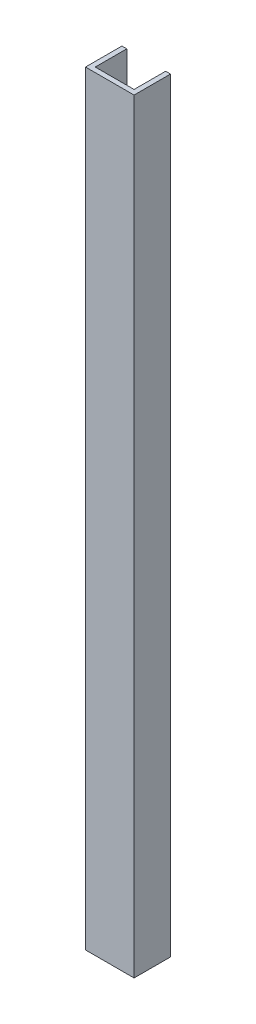
ISO-10303-21;
HEADER;
FILE_DESCRIPTION(('STEP AP214'),'2;1');
FILE_NAME('part.step','',(''),(''),'','','');
FILE_SCHEMA(('AUTOMOTIVE_DESIGN { 1 0 10303 214 1 1 1 1 }'));
ENDSEC;
DATA;
#1=APPLICATION_CONTEXT('core data for automotive mechanical design processes');
#2=APPLICATION_PROTOCOL_DEFINITION('international standard','automotive_design',2000,#1);
#3=PRODUCT_CONTEXT('',#1,'mechanical');
#4=PRODUCT('Part','Part','',(#3));
#5=PRODUCT_RELATED_PRODUCT_CATEGORY('part','',(#4));
#6=PRODUCT_DEFINITION_FORMATION('','',#4);
#7=PRODUCT_DEFINITION_CONTEXT('part definition',#1,'design');
#8=PRODUCT_DEFINITION('design','',#6,#7);
#9=PRODUCT_DEFINITION_SHAPE('','',#8);
#10=(LENGTH_UNIT() NAMED_UNIT(*) SI_UNIT(.MILLI.,.METRE.));
#11=(NAMED_UNIT(*) PLANE_ANGLE_UNIT() SI_UNIT($,.RADIAN.));
#12=(NAMED_UNIT(*) SI_UNIT($,.STERADIAN.) SOLID_ANGLE_UNIT());
#13=UNCERTAINTY_MEASURE_WITH_UNIT(LENGTH_MEASURE(1.E-05),#10,'distance_accuracy_value','');
#14=(GEOMETRIC_REPRESENTATION_CONTEXT(3) GLOBAL_UNCERTAINTY_ASSIGNED_CONTEXT((#13)) GLOBAL_UNIT_ASSIGNED_CONTEXT((#10,
#11,#12)) REPRESENTATION_CONTEXT('',''));
#15=CARTESIAN_POINT('',(0.,0.,0.));
#16=DIRECTION('',(0.,0.,1.));
#17=DIRECTION('',(1.,0.,0.));
#18=AXIS2_PLACEMENT_3D('',#15,#16,#17);
#19=CARTESIAN_POINT('',(8.00000000000001,315.,0.));
#20=DIRECTION('',(1.,0.,0.));
#21=DIRECTION('',(0.,0.,-1.));
#22=AXIS2_PLACEMENT_3D('',#19,#20,#21);
#23=PLANE('',#22);
#24=DIRECTION('',(0.,0.,1.));
#25=VECTOR('',#24,1.);
#26=CARTESIAN_POINT('',(8.00000000000001,0.,0.));
#27=LINE('',#26,#25);
#28=CARTESIAN_POINT('',(8.00000000000001,0.,-13.));
#29=VERTEX_POINT('',#28);
#30=CARTESIAN_POINT('',(8.00000000000001,0.,0.));
#31=VERTEX_POINT('',#30);
#32=EDGE_CURVE('E132',#29,#31,#27,.T.);
#33=ORIENTED_EDGE('',*,*,#32,.T.);
#34=DIRECTION('',(0.,-1.,0.));
#35=VECTOR('',#34,1.);
#36=CARTESIAN_POINT('',(8.00000000000001,315.,0.));
#37=LINE('',#36,#35);
#38=CARTESIAN_POINT('',(8.00000000000001,315.,0.));
#39=VERTEX_POINT('',#38);
#40=EDGE_CURVE('E11',#39,#31,#37,.T.);
#41=ORIENTED_EDGE('',*,*,#40,.F.);
#42=DIRECTION('',(0.,0.,1.));
#43=VECTOR('',#42,1.);
#44=CARTESIAN_POINT('',(8.00000000000001,315.,0.));
#45=LINE('',#44,#43);
#46=CARTESIAN_POINT('',(8.00000000000001,315.,-13.));
#47=VERTEX_POINT('',#46);
#48=EDGE_CURVE('E146',#47,#39,#45,.T.);
#49=ORIENTED_EDGE('',*,*,#48,.F.);
#50=DIRECTION('',(0.,-1.,0.));
#51=VECTOR('',#50,1.);
#52=CARTESIAN_POINT('',(8.00000000000001,315.,-13.));
#53=LINE('',#52,#51);
#54=EDGE_CURVE('E128',#47,#29,#53,.T.);
#55=ORIENTED_EDGE('',*,*,#54,.T.);
#56=EDGE_LOOP('',(#33,#41,#49,#55));
#57=FACE_BOUND('',#56,.T.);
#58=ADVANCED_FACE('F36',(#57),#23,.F.);
#59=CARTESIAN_POINT('',(-7.99999999999999,315.,0.));
#60=DIRECTION('',(0.,0.,1.));
#61=DIRECTION('',(1.,0.,0.));
#62=AXIS2_PLACEMENT_3D('',#59,#60,#61);
#63=PLANE('',#62);
#64=DIRECTION('',(-1.,0.,0.));
#65=VECTOR('',#64,1.);
#66=CARTESIAN_POINT('',(-7.99999999999999,0.,0.));
#67=LINE('',#66,#65);
#68=CARTESIAN_POINT('',(-7.99999999999999,0.,0.));
#69=VERTEX_POINT('',#68);
#70=EDGE_CURVE('E135',#31,#69,#67,.T.);
#71=ORIENTED_EDGE('',*,*,#70,.T.);
#72=DIRECTION('',(0.,-1.,0.));
#73=VECTOR('',#72,1.);
#74=CARTESIAN_POINT('',(-7.99999999999999,315.,0.));
#75=LINE('',#74,#73);
#76=CARTESIAN_POINT('',(-7.99999999999999,315.,0.));
#77=VERTEX_POINT('',#76);
#78=EDGE_CURVE('E44',#77,#69,#75,.T.);
#79=ORIENTED_EDGE('',*,*,#78,.F.);
#80=DIRECTION('',(-1.,0.,0.));
#81=VECTOR('',#80,1.);
#82=CARTESIAN_POINT('',(-7.99999999999999,315.,0.));
#83=LINE('',#82,#81);
#84=EDGE_CURVE('E95',#39,#77,#83,.T.);
#85=ORIENTED_EDGE('',*,*,#84,.F.);
#86=ORIENTED_EDGE('',*,*,#40,.T.);
#87=EDGE_LOOP('',(#71,#79,#85,#86));
#88=FACE_BOUND('',#87,.T.);
#89=ADVANCED_FACE('F181',(#88),#63,.F.);
#90=CARTESIAN_POINT('',(-7.99999999999999,315.,0.));
#91=DIRECTION('',(-1.,0.,0.));
#92=DIRECTION('',(0.,0.,1.));
#93=AXIS2_PLACEMENT_3D('',#90,#91,#92);
#94=PLANE('',#93);
#95=DIRECTION('',(0.,0.,-1.));
#96=VECTOR('',#95,1.);
#97=CARTESIAN_POINT('',(-7.99999999999999,0.,0.));
#98=LINE('',#97,#96);
#99=CARTESIAN_POINT('',(-8.,0.,-13.));
#100=VERTEX_POINT('',#99);
#101=EDGE_CURVE('E137',#69,#100,#98,.T.);
#102=ORIENTED_EDGE('',*,*,#101,.T.);
#103=DIRECTION('',(0.,-1.,0.));
#104=VECTOR('',#103,1.);
#105=CARTESIAN_POINT('',(-8.,315.,-13.));
#106=LINE('',#105,#104);
#107=CARTESIAN_POINT('',(-8.,315.,-13.));
#108=VERTEX_POINT('',#107);
#109=EDGE_CURVE('E153',#108,#100,#106,.T.);
#110=ORIENTED_EDGE('',*,*,#109,.F.);
#111=DIRECTION('',(0.,0.,-1.));
#112=VECTOR('',#111,1.);
#113=CARTESIAN_POINT('',(-7.99999999999999,315.,0.));
#114=LINE('',#113,#112);
#115=EDGE_CURVE('E161',#77,#108,#114,.T.);
#116=ORIENTED_EDGE('',*,*,#115,.F.);
#117=ORIENTED_EDGE('',*,*,#78,.T.);
#118=EDGE_LOOP('',(#102,#110,#116,#117));
#119=FACE_BOUND('',#118,.T.);
#120=ADVANCED_FACE('F159',(#119),#94,.F.);
#121=CARTESIAN_POINT('',(-8.,315.,-13.));
#122=DIRECTION('',(0.,0.,1.));
#123=DIRECTION('',(1.,0.,0.));
#124=AXIS2_PLACEMENT_3D('',#121,#122,#123);
#125=PLANE('',#124);
#126=DIRECTION('',(-1.,0.,0.));
#127=VECTOR('',#126,1.);
#128=CARTESIAN_POINT('',(-8.,0.,-13.));
#129=LINE('',#128,#127);
#130=CARTESIAN_POINT('',(-10.,0.,-13.));
#131=VERTEX_POINT('',#130);
#132=EDGE_CURVE('E139',#100,#131,#129,.T.);
#133=ORIENTED_EDGE('',*,*,#132,.T.);
#134=DIRECTION('',(0.,-1.,0.));
#135=VECTOR('',#134,1.);
#136=CARTESIAN_POINT('',(-10.,315.,-13.));
#137=LINE('',#136,#135);
#138=CARTESIAN_POINT('',(-10.,315.,-13.));
#139=VERTEX_POINT('',#138);
#140=EDGE_CURVE('E150',#139,#131,#137,.T.);
#141=ORIENTED_EDGE('',*,*,#140,.F.);
#142=DIRECTION('',(-1.,0.,0.));
#143=VECTOR('',#142,1.);
#144=CARTESIAN_POINT('',(-8.,315.,-13.));
#145=LINE('',#144,#143);
#146=EDGE_CURVE('E173',#108,#139,#145,.T.);
#147=ORIENTED_EDGE('',*,*,#146,.F.);
#148=ORIENTED_EDGE('',*,*,#109,.T.);
#149=EDGE_LOOP('',(#133,#141,#147,#148));
#150=FACE_BOUND('',#149,.T.);
#151=ADVANCED_FACE('F169',(#150),#125,.F.);
#152=CARTESIAN_POINT('',(-10.,315.,-13.));
#153=DIRECTION('',(1.,0.,0.));
#154=DIRECTION('',(0.,0.,-1.));
#155=AXIS2_PLACEMENT_3D('',#152,#153,#154);
#156=PLANE('',#155);
#157=DIRECTION('',(0.,0.,1.));
#158=VECTOR('',#157,1.);
#159=CARTESIAN_POINT('',(-10.,0.,-13.));
#160=LINE('',#159,#158);
#161=CARTESIAN_POINT('',(-9.99999999999999,0.,2.));
#162=VERTEX_POINT('',#161);
#163=EDGE_CURVE('E141',#131,#162,#160,.T.);
#164=ORIENTED_EDGE('',*,*,#163,.T.);
#165=DIRECTION('',(0.,-1.,0.));
#166=VECTOR('',#165,1.);
#167=CARTESIAN_POINT('',(-9.99999999999999,315.,2.));
#168=LINE('',#167,#166);
#169=CARTESIAN_POINT('',(-9.99999999999999,315.,2.));
#170=VERTEX_POINT('',#169);
#171=EDGE_CURVE('E123',#170,#162,#168,.T.);
#172=ORIENTED_EDGE('',*,*,#171,.F.);
#173=DIRECTION('',(0.,0.,1.));
#174=VECTOR('',#173,1.);
#175=CARTESIAN_POINT('',(-10.,315.,-13.));
#176=LINE('',#175,#174);
#177=EDGE_CURVE('E114',#139,#170,#176,.T.);
#178=ORIENTED_EDGE('',*,*,#177,.F.);
#179=ORIENTED_EDGE('',*,*,#140,.T.);
#180=EDGE_LOOP('',(#164,#172,#178,#179));
#181=FACE_BOUND('',#180,.T.);
#182=ADVANCED_FACE('F172',(#181),#156,.F.);
#183=CARTESIAN_POINT('',(10.,315.,2.));
#184=DIRECTION('',(0.,0.,-1.));
#185=DIRECTION('',(-1.,0.,0.));
#186=AXIS2_PLACEMENT_3D('',#183,#184,#185);
#187=PLANE('',#186);
#188=DIRECTION('',(1.,0.,0.));
#189=VECTOR('',#188,1.);
#190=CARTESIAN_POINT('',(10.,0.,2.));
#191=LINE('',#190,#189);
#192=CARTESIAN_POINT('',(10.,0.,2.));
#193=VERTEX_POINT('',#192);
#194=EDGE_CURVE('E122',#162,#193,#191,.T.);
#195=ORIENTED_EDGE('',*,*,#194,.T.);
#196=DIRECTION('',(0.,-1.,0.));
#197=VECTOR('',#196,1.);
#198=CARTESIAN_POINT('',(10.,315.,2.));
#199=LINE('',#198,#197);
#200=CARTESIAN_POINT('',(10.,315.,2.));
#201=VERTEX_POINT('',#200);
#202=EDGE_CURVE('E119',#201,#193,#199,.T.);
#203=ORIENTED_EDGE('',*,*,#202,.F.);
#204=DIRECTION('',(1.,0.,0.));
#205=VECTOR('',#204,1.);
#206=CARTESIAN_POINT('',(10.,315.,2.));
#207=LINE('',#206,#205);
#208=EDGE_CURVE('E108',#170,#201,#207,.T.);
#209=ORIENTED_EDGE('',*,*,#208,.F.);
#210=ORIENTED_EDGE('',*,*,#171,.T.);
#211=EDGE_LOOP('',(#195,#203,#209,#210));
#212=FACE_BOUND('',#211,.T.);
#213=ADVANCED_FACE('F120',(#212),#187,.F.);
#214=CARTESIAN_POINT('',(10.,315.,-13.));
#215=DIRECTION('',(-1.,0.,0.));
#216=DIRECTION('',(0.,0.,1.));
#217=AXIS2_PLACEMENT_3D('',#214,#215,#216);
#218=PLANE('',#217);
#219=DIRECTION('',(0.,0.,-1.));
#220=VECTOR('',#219,1.);
#221=CARTESIAN_POINT('',(10.,0.,-13.));
#222=LINE('',#221,#220);
#223=CARTESIAN_POINT('',(10.,0.,-13.));
#224=VERTEX_POINT('',#223);
#225=EDGE_CURVE('E81',#193,#224,#222,.T.);
#226=ORIENTED_EDGE('',*,*,#225,.T.);
#227=DIRECTION('',(0.,-1.,0.));
#228=VECTOR('',#227,1.);
#229=CARTESIAN_POINT('',(10.,315.,-13.));
#230=LINE('',#229,#228);
#231=CARTESIAN_POINT('',(10.,315.,-13.));
#232=VERTEX_POINT('',#231);
#233=EDGE_CURVE('E124',#232,#224,#230,.T.);
#234=ORIENTED_EDGE('',*,*,#233,.F.);
#235=DIRECTION('',(0.,0.,-1.));
#236=VECTOR('',#235,1.);
#237=CARTESIAN_POINT('',(10.,315.,-13.));
#238=LINE('',#237,#236);
#239=EDGE_CURVE('E112',#201,#232,#238,.T.);
#240=ORIENTED_EDGE('',*,*,#239,.F.);
#241=ORIENTED_EDGE('',*,*,#202,.T.);
#242=EDGE_LOOP('',(#226,#234,#240,#241));
#243=FACE_BOUND('',#242,.T.);
#244=ADVANCED_FACE('F126',(#243),#218,.F.);
#245=CARTESIAN_POINT('',(8.00000000000001,315.,-13.));
#246=DIRECTION('',(0.,0.,1.));
#247=DIRECTION('',(1.,0.,0.));
#248=AXIS2_PLACEMENT_3D('',#245,#246,#247);
#249=PLANE('',#248);
#250=DIRECTION('',(-1.,0.,0.));
#251=VECTOR('',#250,1.);
#252=CARTESIAN_POINT('',(8.00000000000001,0.,-13.));
#253=LINE('',#252,#251);
#254=EDGE_CURVE('E87',#224,#29,#253,.T.);
#255=ORIENTED_EDGE('',*,*,#254,.T.);
#256=ORIENTED_EDGE('',*,*,#54,.F.);
#257=DIRECTION('',(-1.,0.,0.));
#258=VECTOR('',#257,1.);
#259=CARTESIAN_POINT('',(8.00000000000001,315.,-13.));
#260=LINE('',#259,#258);
#261=EDGE_CURVE('E52',#232,#47,#260,.T.);
#262=ORIENTED_EDGE('',*,*,#261,.F.);
#263=ORIENTED_EDGE('',*,*,#233,.T.);
#264=EDGE_LOOP('',(#255,#256,#262,#263));
#265=FACE_BOUND('',#264,.T.);
#266=ADVANCED_FACE('F197',(#265),#249,.F.);
#267=CARTESIAN_POINT('',(0.,315.,0.));
#268=DIRECTION('',(0.,-1.,0.));
#269=DIRECTION('',(0.,0.,-1.));
#270=AXIS2_PLACEMENT_3D('',#267,#268,#269);
#271=PLANE('',#270);
#272=ORIENTED_EDGE('',*,*,#48,.T.);
#273=ORIENTED_EDGE('',*,*,#84,.T.);
#274=ORIENTED_EDGE('',*,*,#115,.T.);
#275=ORIENTED_EDGE('',*,*,#146,.T.);
#276=ORIENTED_EDGE('',*,*,#177,.T.);
#277=ORIENTED_EDGE('',*,*,#208,.T.);
#278=ORIENTED_EDGE('',*,*,#239,.T.);
#279=ORIENTED_EDGE('',*,*,#261,.T.);
#280=EDGE_LOOP('',(#272,#273,#274,#275,#276,#277,#278,#279));
#281=FACE_BOUND('',#280,.T.);
#282=ADVANCED_FACE('F110',(#281),#271,.F.);
#283=CARTESIAN_POINT('',(0.,0.,0.));
#284=DIRECTION('',(0.,-1.,0.));
#285=DIRECTION('',(0.,0.,-1.));
#286=AXIS2_PLACEMENT_3D('',#283,#284,#285);
#287=PLANE('',#286);
#288=ORIENTED_EDGE('',*,*,#32,.F.);
#289=ORIENTED_EDGE('',*,*,#254,.F.);
#290=ORIENTED_EDGE('',*,*,#225,.F.);
#291=ORIENTED_EDGE('',*,*,#194,.F.);
#292=ORIENTED_EDGE('',*,*,#163,.F.);
#293=ORIENTED_EDGE('',*,*,#132,.F.);
#294=ORIENTED_EDGE('',*,*,#101,.F.);
#295=ORIENTED_EDGE('',*,*,#70,.F.);
#296=EDGE_LOOP('',(#288,#289,#290,#291,#292,#293,#294,#295));
#297=FACE_BOUND('',#296,.T.);
#298=ADVANCED_FACE('F165',(#297),#287,.T.);
#299=CLOSED_SHELL('',(#58,#89,#120,#151,#182,#213,#244,#266,#282,#298));
#300=MANIFOLD_SOLID_BREP('B2',#299);
#301=ADVANCED_BREP_SHAPE_REPRESENTATION('',(#18,#300),#14);
#302=SHAPE_DEFINITION_REPRESENTATION(#9,#301);
ENDSEC;
END-ISO-10303-21;
